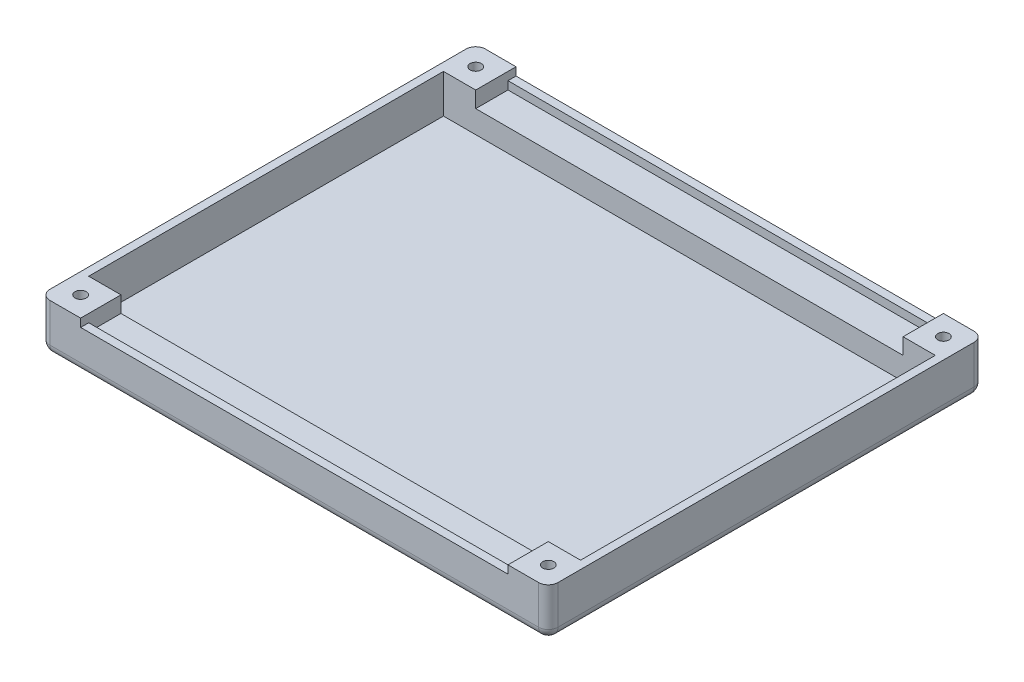
ISO-10303-21;
HEADER;
FILE_DESCRIPTION(('STEP AP214'),'2;1');
FILE_NAME('part.step','',(''),(''),'','','');
FILE_SCHEMA(('AUTOMOTIVE_DESIGN { 1 0 10303 214 1 1 1 1 }'));
ENDSEC;
DATA;
#1=APPLICATION_CONTEXT('core data for automotive mechanical design processes');
#2=APPLICATION_PROTOCOL_DEFINITION('international standard','automotive_design',2000,#1);
#3=PRODUCT_CONTEXT('',#1,'mechanical');
#4=PRODUCT('Part','Part','',(#3));
#5=PRODUCT_RELATED_PRODUCT_CATEGORY('part','',(#4));
#6=PRODUCT_DEFINITION_FORMATION('','',#4);
#7=PRODUCT_DEFINITION_CONTEXT('part definition',#1,'design');
#8=PRODUCT_DEFINITION('design','',#6,#7);
#9=PRODUCT_DEFINITION_SHAPE('','',#8);
#10=(LENGTH_UNIT() NAMED_UNIT(*) SI_UNIT(.MILLI.,.METRE.));
#11=(NAMED_UNIT(*) PLANE_ANGLE_UNIT() SI_UNIT($,.RADIAN.));
#12=(NAMED_UNIT(*) SI_UNIT($,.STERADIAN.) SOLID_ANGLE_UNIT());
#13=UNCERTAINTY_MEASURE_WITH_UNIT(LENGTH_MEASURE(1.E-05),#10,'distance_accuracy_value','');
#14=(GEOMETRIC_REPRESENTATION_CONTEXT(3) GLOBAL_UNCERTAINTY_ASSIGNED_CONTEXT((#13)) GLOBAL_UNIT_ASSIGNED_CONTEXT((#10,
#11,#12)) REPRESENTATION_CONTEXT('',''));
#15=CARTESIAN_POINT('',(0.,0.,0.));
#16=DIRECTION('',(0.,0.,1.));
#17=DIRECTION('',(1.,0.,0.));
#18=AXIS2_PLACEMENT_3D('',#15,#16,#17);
#19=CARTESIAN_POINT('',(0.,19.05,0.));
#20=DIRECTION('',(0.,-1.,0.));
#21=DIRECTION('',(0.,0.,-1.));
#22=AXIS2_PLACEMENT_3D('',#19,#20,#21);
#23=PLANE('',#22);
#24=CARTESIAN_POINT('',(92.075,19.05,-77.7875));
#25=DIRECTION('',(0.,1.,0.));
#26=DIRECTION('',(0.,0.,1.));
#27=AXIS2_PLACEMENT_3D('',#24,#25,#26);
#28=CIRCLE('',#27,2.2);
#29=CARTESIAN_POINT('',(92.075,19.05,-75.5875));
#30=VERTEX_POINT('',#29);
#31=EDGE_CURVE('E401',#30,#30,#28,.T.);
#32=ORIENTED_EDGE('',*,*,#31,.F.);
#33=EDGE_LOOP('',(#32));
#34=FACE_BOUND('',#33,.T.);
#35=CARTESIAN_POINT('',(92.075,19.05,77.7875));
#36=DIRECTION('',(0.,1.,0.));
#37=DIRECTION('',(0.,0.,-1.));
#38=AXIS2_PLACEMENT_3D('',#35,#36,#37);
#39=CIRCLE('',#38,2.2);
#40=CARTESIAN_POINT('',(92.075,19.05,75.5875));
#41=VERTEX_POINT('',#40);
#42=EDGE_CURVE('E507',#41,#41,#39,.T.);
#43=ORIENTED_EDGE('',*,*,#42,.F.);
#44=EDGE_LOOP('',(#43));
#45=FACE_BOUND('',#44,.T.);
#46=DIRECTION('',(1.,0.,0.));
#47=VECTOR('',#46,1.);
#48=CARTESIAN_POINT('',(-100.0125,19.05,85.725));
#49=LINE('',#48,#47);
#50=CARTESIAN_POINT('',(84.1375,19.05,85.725));
#51=VERTEX_POINT('',#50);
#52=CARTESIAN_POINT('',(96.2024999999999,19.05,85.725));
#53=VERTEX_POINT('',#52);
#54=EDGE_CURVE('E385',#51,#53,#49,.T.);
#55=ORIENTED_EDGE('',*,*,#54,.T.);
#56=CARTESIAN_POINT('',(96.2025,19.05,81.915));
#57=DIRECTION('',(0.,-1.,0.));
#58=DIRECTION('',(0.,0.,-1.));
#59=AXIS2_PLACEMENT_3D('',#56,#57,#58);
#60=CIRCLE('',#59,3.81);
#61=CARTESIAN_POINT('',(100.0125,19.05,81.915));
#62=VERTEX_POINT('',#61);
#63=EDGE_CURVE('E454',#53,#62,#60,.F.);
#64=ORIENTED_EDGE('',*,*,#63,.T.);
#65=DIRECTION('',(0.,0.,-1.));
#66=VECTOR('',#65,1.);
#67=CARTESIAN_POINT('',(100.0125,19.05,85.725));
#68=LINE('',#67,#66);
#69=CARTESIAN_POINT('',(100.0125,19.05,-81.915));
#70=VERTEX_POINT('',#69);
#71=EDGE_CURVE('E373',#62,#70,#68,.T.);
#72=ORIENTED_EDGE('',*,*,#71,.T.);
#73=CARTESIAN_POINT('',(96.2025,19.05,-81.915));
#74=DIRECTION('',(0.,-1.,0.));
#75=DIRECTION('',(0.,0.,-1.));
#76=AXIS2_PLACEMENT_3D('',#73,#74,#75);
#77=CIRCLE('',#76,3.81);
#78=CARTESIAN_POINT('',(96.2024999999999,19.05,-85.725));
#79=VERTEX_POINT('',#78);
#80=EDGE_CURVE('E451',#70,#79,#77,.F.);
#81=ORIENTED_EDGE('',*,*,#80,.T.);
#82=DIRECTION('',(-1.,0.,0.));
#83=VECTOR('',#82,1.);
#84=CARTESIAN_POINT('',(-100.0125,19.05,-85.725));
#85=LINE('',#84,#83);
#86=CARTESIAN_POINT('',(84.1375,19.05,-85.725));
#87=VERTEX_POINT('',#86);
#88=EDGE_CURVE('E378',#79,#87,#85,.T.);
#89=ORIENTED_EDGE('',*,*,#88,.T.);
#90=DIRECTION('',(0.,0.,-1.));
#91=VECTOR('',#90,1.);
#92=CARTESIAN_POINT('',(84.1375,19.05,85.725));
#93=LINE('',#92,#91);
#94=CARTESIAN_POINT('',(84.1375,19.05,-69.85));
#95=VERTEX_POINT('',#94);
#96=EDGE_CURVE('E284',#95,#87,#93,.T.);
#97=ORIENTED_EDGE('',*,*,#96,.F.);
#98=DIRECTION('',(-1.,0.,0.));
#99=VECTOR('',#98,1.);
#100=CARTESIAN_POINT('',(-96.8375,19.05,-69.85));
#101=LINE('',#100,#99);
#102=CARTESIAN_POINT('',(96.8374999999999,19.05,-69.85));
#103=VERTEX_POINT('',#102);
#104=EDGE_CURVE('E337',#103,#95,#101,.T.);
#105=ORIENTED_EDGE('',*,*,#104,.F.);
#106=DIRECTION('',(0.,0.,-1.));
#107=VECTOR('',#106,1.);
#108=CARTESIAN_POINT('',(96.8374999999999,19.05,69.85));
#109=LINE('',#108,#107);
#110=CARTESIAN_POINT('',(96.8374999999999,19.05,69.85));
#111=VERTEX_POINT('',#110);
#112=EDGE_CURVE('E326',#111,#103,#109,.T.);
#113=ORIENTED_EDGE('',*,*,#112,.F.);
#114=DIRECTION('',(1.,0.,0.));
#115=VECTOR('',#114,1.);
#116=CARTESIAN_POINT('',(-96.8375,19.05,69.85));
#117=LINE('',#116,#115);
#118=CARTESIAN_POINT('',(84.1375,19.05,69.85));
#119=VERTEX_POINT('',#118);
#120=EDGE_CURVE('E332',#119,#111,#117,.T.);
#121=ORIENTED_EDGE('',*,*,#120,.F.);
#122=EDGE_CURVE('E306',#51,#119,#93,.T.);
#123=ORIENTED_EDGE('',*,*,#122,.F.);
#124=EDGE_LOOP('',(#55,#64,#72,#81,#89,#97,#105,#113,#121,#123));
#125=FACE_BOUND('',#124,.T.);
#126=ADVANCED_FACE('F41',(#34,#45,#125),#23,.F.);
#127=CARTESIAN_POINT('',(100.0125,19.05,85.725));
#128=DIRECTION('',(-1.,0.,0.));
#129=DIRECTION('',(0.,0.,1.));
#130=AXIS2_PLACEMENT_3D('',#127,#128,#129);
#131=PLANE('',#130);
#132=ORIENTED_EDGE('',*,*,#71,.F.);
#133=DIRECTION('',(0.,-1.,0.));
#134=VECTOR('',#133,1.);
#135=CARTESIAN_POINT('',(100.0125,19.05,81.915));
#136=LINE('',#135,#134);
#137=CARTESIAN_POINT('',(100.0125,3.81,81.915));
#138=VERTEX_POINT('',#137);
#139=EDGE_CURVE('E448',#62,#138,#136,.T.);
#140=ORIENTED_EDGE('',*,*,#139,.T.);
#141=DIRECTION('',(0.,0.,-1.));
#142=VECTOR('',#141,1.);
#143=CARTESIAN_POINT('',(100.0125,3.81,-85.725));
#144=LINE('',#143,#142);
#145=CARTESIAN_POINT('',(100.0125,3.81,-81.915));
#146=VERTEX_POINT('',#145);
#147=EDGE_CURVE('E445',#138,#146,#144,.T.);
#148=ORIENTED_EDGE('',*,*,#147,.T.);
#149=DIRECTION('',(0.,-1.,0.));
#150=VECTOR('',#149,1.);
#151=CARTESIAN_POINT('',(100.0125,19.05,-81.915));
#152=LINE('',#151,#150);
#153=EDGE_CURVE('E442',#146,#70,#152,.F.);
#154=ORIENTED_EDGE('',*,*,#153,.T.);
#155=EDGE_LOOP('',(#132,#140,#148,#154));
#156=FACE_BOUND('',#155,.T.);
#157=ADVANCED_FACE('F536',(#156),#131,.F.);
#158=CARTESIAN_POINT('',(-100.0125,19.05,-85.725));
#159=DIRECTION('',(0.,0.,1.));
#160=DIRECTION('',(1.,0.,0.));
#161=AXIS2_PLACEMENT_3D('',#158,#159,#160);
#162=PLANE('',#161);
#163=ORIENTED_EDGE('',*,*,#88,.F.);
#164=DIRECTION('',(0.,-1.,0.));
#165=VECTOR('',#164,1.);
#166=CARTESIAN_POINT('',(96.2025,19.05,-85.725));
#167=LINE('',#166,#165);
#168=CARTESIAN_POINT('',(96.2025,3.81,-85.725));
#169=VERTEX_POINT('',#168);
#170=EDGE_CURVE('E12',#79,#169,#167,.T.);
#171=ORIENTED_EDGE('',*,*,#170,.T.);
#172=DIRECTION('',(-1.,0.,0.));
#173=VECTOR('',#172,1.);
#174=CARTESIAN_POINT('',(-100.0125,3.81,-85.725));
#175=LINE('',#174,#173);
#176=CARTESIAN_POINT('',(-96.2025,3.81,-85.725));
#177=VERTEX_POINT('',#176);
#178=EDGE_CURVE('E51',#169,#177,#175,.T.);
#179=ORIENTED_EDGE('',*,*,#178,.T.);
#180=DIRECTION('',(0.,-1.,0.));
#181=VECTOR('',#180,1.);
#182=CARTESIAN_POINT('',(-96.2025,19.05,-85.725));
#183=LINE('',#182,#181);
#184=CARTESIAN_POINT('',(-96.2025,19.05,-85.725));
#185=VERTEX_POINT('',#184);
#186=EDGE_CURVE('E457',#177,#185,#183,.F.);
#187=ORIENTED_EDGE('',*,*,#186,.T.);
#188=CARTESIAN_POINT('',(-84.1374999999999,19.05,-85.725));
#189=VERTEX_POINT('',#188);
#190=EDGE_CURVE('E377',#189,#185,#85,.T.);
#191=ORIENTED_EDGE('',*,*,#190,.F.);
#192=DIRECTION('',(0.,1.,0.));
#193=VECTOR('',#192,1.);
#194=CARTESIAN_POINT('',(-84.1374999999999,15.875,-85.725));
#195=LINE('',#194,#193);
#196=CARTESIAN_POINT('',(-84.1374999999999,15.875,-85.725));
#197=VERTEX_POINT('',#196);
#198=EDGE_CURVE('E318',#197,#189,#195,.T.);
#199=ORIENTED_EDGE('',*,*,#198,.F.);
#200=DIRECTION('',(-1.,0.,0.));
#201=VECTOR('',#200,1.);
#202=CARTESIAN_POINT('',(-84.1374999999999,15.875,-85.725));
#203=LINE('',#202,#201);
#204=CARTESIAN_POINT('',(84.1375,15.875,-85.725));
#205=VERTEX_POINT('',#204);
#206=EDGE_CURVE('E291',#205,#197,#203,.T.);
#207=ORIENTED_EDGE('',*,*,#206,.F.);
#208=DIRECTION('',(0.,1.,0.));
#209=VECTOR('',#208,1.);
#210=CARTESIAN_POINT('',(84.1375,15.875,-85.725));
#211=LINE('',#210,#209);
#212=EDGE_CURVE('E305',#205,#87,#211,.T.);
#213=ORIENTED_EDGE('',*,*,#212,.T.);
#214=EDGE_LOOP('',(#163,#171,#179,#187,#191,#199,#207,#213));
#215=FACE_BOUND('',#214,.T.);
#216=ADVANCED_FACE('F570',(#215),#162,.F.);
#217=CARTESIAN_POINT('',(-100.0125,19.05,85.725));
#218=DIRECTION('',(1.,0.,0.));
#219=DIRECTION('',(0.,0.,-1.));
#220=AXIS2_PLACEMENT_3D('',#217,#218,#219);
#221=PLANE('',#220);
#222=DIRECTION('',(0.,0.,1.));
#223=VECTOR('',#222,1.);
#224=CARTESIAN_POINT('',(-100.0125,3.81,85.725));
#225=LINE('',#224,#223);
#226=CARTESIAN_POINT('',(-100.0125,3.81,-81.915));
#227=VERTEX_POINT('',#226);
#228=CARTESIAN_POINT('',(-100.0125,3.81,81.915));
#229=VERTEX_POINT('',#228);
#230=EDGE_CURVE('E407',#227,#229,#225,.T.);
#231=ORIENTED_EDGE('',*,*,#230,.T.);
#232=DIRECTION('',(0.,-1.,0.));
#233=VECTOR('',#232,1.);
#234=CARTESIAN_POINT('',(-100.0125,19.05,81.915));
#235=LINE('',#234,#233);
#236=CARTESIAN_POINT('',(-100.0125,19.05,81.915));
#237=VERTEX_POINT('',#236);
#238=EDGE_CURVE('E411',#229,#237,#235,.F.);
#239=ORIENTED_EDGE('',*,*,#238,.T.);
#240=DIRECTION('',(0.,0.,1.));
#241=VECTOR('',#240,1.);
#242=CARTESIAN_POINT('',(-100.0125,19.05,85.725));
#243=LINE('',#242,#241);
#244=CARTESIAN_POINT('',(-100.0125,19.05,-81.915));
#245=VERTEX_POINT('',#244);
#246=EDGE_CURVE('E381',#245,#237,#243,.T.);
#247=ORIENTED_EDGE('',*,*,#246,.F.);
#248=DIRECTION('',(0.,-1.,0.));
#249=VECTOR('',#248,1.);
#250=CARTESIAN_POINT('',(-100.0125,19.05,-81.915));
#251=LINE('',#250,#249);
#252=EDGE_CURVE('E396',#245,#227,#251,.T.);
#253=ORIENTED_EDGE('',*,*,#252,.T.);
#254=EDGE_LOOP('',(#231,#239,#247,#253));
#255=FACE_BOUND('',#254,.T.);
#256=ADVANCED_FACE('F598',(#255),#221,.F.);
#257=CARTESIAN_POINT('',(-100.0125,19.05,85.725));
#258=DIRECTION('',(0.,0.,-1.));
#259=DIRECTION('',(-1.,0.,0.));
#260=AXIS2_PLACEMENT_3D('',#257,#258,#259);
#261=PLANE('',#260);
#262=CARTESIAN_POINT('',(-96.2025,19.05,85.725));
#263=VERTEX_POINT('',#262);
#264=CARTESIAN_POINT('',(-84.1374999999999,19.05,85.725));
#265=VERTEX_POINT('',#264);
#266=EDGE_CURVE('E386',#263,#265,#49,.T.);
#267=ORIENTED_EDGE('',*,*,#266,.F.);
#268=DIRECTION('',(0.,-1.,0.));
#269=VECTOR('',#268,1.);
#270=CARTESIAN_POINT('',(-96.2025,19.05,85.725));
#271=LINE('',#270,#269);
#272=CARTESIAN_POINT('',(-96.2025,3.81,85.725));
#273=VERTEX_POINT('',#272);
#274=EDGE_CURVE('E433',#263,#273,#271,.T.);
#275=ORIENTED_EDGE('',*,*,#274,.T.);
#276=DIRECTION('',(1.,0.,0.));
#277=VECTOR('',#276,1.);
#278=CARTESIAN_POINT('',(100.0125,3.81,85.725));
#279=LINE('',#278,#277);
#280=CARTESIAN_POINT('',(96.2025,3.81,85.725));
#281=VERTEX_POINT('',#280);
#282=EDGE_CURVE('E430',#273,#281,#279,.T.);
#283=ORIENTED_EDGE('',*,*,#282,.T.);
#284=DIRECTION('',(0.,-1.,0.));
#285=VECTOR('',#284,1.);
#286=CARTESIAN_POINT('',(96.2025,19.05,85.725));
#287=LINE('',#286,#285);
#288=EDGE_CURVE('E427',#281,#53,#287,.F.);
#289=ORIENTED_EDGE('',*,*,#288,.T.);
#290=ORIENTED_EDGE('',*,*,#54,.F.);
#291=DIRECTION('',(0.,1.,0.));
#292=VECTOR('',#291,1.);
#293=CARTESIAN_POINT('',(84.1375,15.875,85.725));
#294=LINE('',#293,#292);
#295=CARTESIAN_POINT('',(84.1375,15.875,85.725));
#296=VERTEX_POINT('',#295);
#297=EDGE_CURVE('E226',#296,#51,#294,.T.);
#298=ORIENTED_EDGE('',*,*,#297,.F.);
#299=DIRECTION('',(1.,0.,0.));
#300=VECTOR('',#299,1.);
#301=CARTESIAN_POINT('',(-84.1374999999999,15.875,85.725));
#302=LINE('',#301,#300);
#303=CARTESIAN_POINT('',(-84.1374999999999,15.875,85.725));
#304=VERTEX_POINT('',#303);
#305=EDGE_CURVE('E301',#304,#296,#302,.T.);
#306=ORIENTED_EDGE('',*,*,#305,.F.);
#307=DIRECTION('',(0.,1.,0.));
#308=VECTOR('',#307,1.);
#309=CARTESIAN_POINT('',(-84.1374999999999,15.875,85.725));
#310=LINE('',#309,#308);
#311=EDGE_CURVE('E314',#304,#265,#310,.T.);
#312=ORIENTED_EDGE('',*,*,#311,.T.);
#313=EDGE_LOOP('',(#267,#275,#283,#289,#290,#298,#306,#312));
#314=FACE_BOUND('',#313,.T.);
#315=ADVANCED_FACE('F608',(#314),#261,.F.);
#316=CARTESIAN_POINT('',(-92.075,19.05,-77.7875));
#317=DIRECTION('',(0.,-1.,0.));
#318=DIRECTION('',(0.,0.,1.));
#319=AXIS2_PLACEMENT_3D('',#316,#317,#318);
#320=CIRCLE('',#319,2.2);
#321=CARTESIAN_POINT('',(-92.075,19.05,-75.5875));
#322=VERTEX_POINT('',#321);
#323=EDGE_CURVE('E511',#322,#322,#320,.T.);
#324=ORIENTED_EDGE('',*,*,#323,.T.);
#325=EDGE_LOOP('',(#324));
#326=FACE_BOUND('',#325,.T.);
#327=CARTESIAN_POINT('',(-92.075,19.05,77.7875));
#328=DIRECTION('',(0.,-1.,0.));
#329=DIRECTION('',(0.,0.,-1.));
#330=AXIS2_PLACEMENT_3D('',#327,#328,#329);
#331=CIRCLE('',#330,2.2);
#332=CARTESIAN_POINT('',(-92.075,19.05,75.5875));
#333=VERTEX_POINT('',#332);
#334=EDGE_CURVE('E518',#333,#333,#331,.T.);
#335=ORIENTED_EDGE('',*,*,#334,.T.);
#336=EDGE_LOOP('',(#335));
#337=FACE_BOUND('',#336,.T.);
#338=ORIENTED_EDGE('',*,*,#246,.T.);
#339=CARTESIAN_POINT('',(-96.2025,19.05,81.915));
#340=DIRECTION('',(0.,-1.,0.));
#341=DIRECTION('',(0.,0.,-1.));
#342=AXIS2_PLACEMENT_3D('',#339,#340,#341);
#343=CIRCLE('',#342,3.81);
#344=EDGE_CURVE('E439',#237,#263,#343,.F.);
#345=ORIENTED_EDGE('',*,*,#344,.T.);
#346=ORIENTED_EDGE('',*,*,#266,.T.);
#347=DIRECTION('',(0.,0.,1.));
#348=VECTOR('',#347,1.);
#349=CARTESIAN_POINT('',(-84.1374999999999,19.05,85.725));
#350=LINE('',#349,#348);
#351=CARTESIAN_POINT('',(-84.1374999999999,19.05,69.85));
#352=VERTEX_POINT('',#351);
#353=EDGE_CURVE('E309',#352,#265,#350,.T.);
#354=ORIENTED_EDGE('',*,*,#353,.F.);
#355=CARTESIAN_POINT('',(-96.8375,19.05,69.85));
#356=VERTEX_POINT('',#355);
#357=EDGE_CURVE('E327',#356,#352,#117,.T.);
#358=ORIENTED_EDGE('',*,*,#357,.F.);
#359=DIRECTION('',(0.,0.,1.));
#360=VECTOR('',#359,1.);
#361=CARTESIAN_POINT('',(-96.8375,19.05,69.85));
#362=LINE('',#361,#360);
#363=CARTESIAN_POINT('',(-96.8375,19.05,-69.85));
#364=VERTEX_POINT('',#363);
#365=EDGE_CURVE('E333',#364,#356,#362,.T.);
#366=ORIENTED_EDGE('',*,*,#365,.F.);
#367=CARTESIAN_POINT('',(-84.1374999999999,19.05,-69.85));
#368=VERTEX_POINT('',#367);
#369=EDGE_CURVE('E340',#368,#364,#101,.T.);
#370=ORIENTED_EDGE('',*,*,#369,.F.);
#371=EDGE_CURVE('E220',#189,#368,#350,.T.);
#372=ORIENTED_EDGE('',*,*,#371,.F.);
#373=ORIENTED_EDGE('',*,*,#190,.T.);
#374=CARTESIAN_POINT('',(-96.2025,19.05,-81.915));
#375=DIRECTION('',(0.,-1.,0.));
#376=DIRECTION('',(0.,0.,-1.));
#377=AXIS2_PLACEMENT_3D('',#374,#375,#376);
#378=CIRCLE('',#377,3.81);
#379=EDGE_CURVE('E436',#185,#245,#378,.F.);
#380=ORIENTED_EDGE('',*,*,#379,.T.);
#381=EDGE_LOOP('',(#338,#345,#346,#354,#358,#366,#370,#372,#373,#380));
#382=FACE_BOUND('',#381,.T.);
#383=ADVANCED_FACE('F539',(#326,#337,#382),#23,.F.);
#384=CARTESIAN_POINT('',(0.,0.,0.));
#385=DIRECTION('',(0.,-1.,0.));
#386=DIRECTION('',(0.,0.,-1.));
#387=AXIS2_PLACEMENT_3D('',#384,#385,#386);
#388=PLANE('',#387);
#389=CARTESIAN_POINT('',(-92.075,0.,-77.7875));
#390=DIRECTION('',(0.,-1.,0.));
#391=DIRECTION('',(0.,0.,-1.));
#392=AXIS2_PLACEMENT_3D('',#389,#390,#391);
#393=CIRCLE('',#392,2.2);
#394=CARTESIAN_POINT('',(-92.075,0.,-79.9875));
#395=VERTEX_POINT('',#394);
#396=EDGE_CURVE('E45',#395,#395,#393,.F.);
#397=ORIENTED_EDGE('',*,*,#396,.T.);
#398=EDGE_LOOP('',(#397));
#399=FACE_BOUND('',#398,.T.);
#400=CARTESIAN_POINT('',(-92.075,0.,77.7875));
#401=DIRECTION('',(0.,-1.,0.));
#402=DIRECTION('',(0.,0.,-1.));
#403=AXIS2_PLACEMENT_3D('',#400,#401,#402);
#404=CIRCLE('',#403,2.2);
#405=CARTESIAN_POINT('',(-92.075,0.,75.5875));
#406=VERTEX_POINT('',#405);
#407=EDGE_CURVE('E508',#406,#406,#404,.F.);
#408=ORIENTED_EDGE('',*,*,#407,.T.);
#409=EDGE_LOOP('',(#408));
#410=FACE_BOUND('',#409,.T.);
#411=DIRECTION('',(1.,0.,0.));
#412=VECTOR('',#411,1.);
#413=CARTESIAN_POINT('',(-100.0125,0.,81.915));
#414=LINE('',#413,#412);
#415=CARTESIAN_POINT('',(96.2025,0.,81.915));
#416=VERTEX_POINT('',#415);
#417=CARTESIAN_POINT('',(-96.2025,0.,81.915));
#418=VERTEX_POINT('',#417);
#419=EDGE_CURVE('E420',#416,#418,#414,.F.);
#420=ORIENTED_EDGE('',*,*,#419,.T.);
#421=DIRECTION('',(0.,0.,1.));
#422=VECTOR('',#421,1.);
#423=CARTESIAN_POINT('',(-96.2025,0.,-85.725));
#424=LINE('',#423,#422);
#425=CARTESIAN_POINT('',(-96.2025,0.,-81.915));
#426=VERTEX_POINT('',#425);
#427=EDGE_CURVE('E423',#418,#426,#424,.F.);
#428=ORIENTED_EDGE('',*,*,#427,.T.);
#429=DIRECTION('',(-1.,0.,0.));
#430=VECTOR('',#429,1.);
#431=CARTESIAN_POINT('',(100.0125,0.,-81.915));
#432=LINE('',#431,#430);
#433=CARTESIAN_POINT('',(96.2025,0.,-81.915));
#434=VERTEX_POINT('',#433);
#435=EDGE_CURVE('E414',#426,#434,#432,.F.);
#436=ORIENTED_EDGE('',*,*,#435,.T.);
#437=DIRECTION('',(0.,0.,-1.));
#438=VECTOR('',#437,1.);
#439=CARTESIAN_POINT('',(96.2025,0.,85.725));
#440=LINE('',#439,#438);
#441=EDGE_CURVE('E417',#434,#416,#440,.F.);
#442=ORIENTED_EDGE('',*,*,#441,.T.);
#443=EDGE_LOOP('',(#420,#428,#436,#442));
#444=FACE_BOUND('',#443,.T.);
#445=CARTESIAN_POINT('',(92.075,0.,-77.7875));
#446=DIRECTION('',(0.,-1.,0.));
#447=DIRECTION('',(0.,0.,-1.));
#448=AXIS2_PLACEMENT_3D('',#445,#446,#447);
#449=CIRCLE('',#448,2.2);
#450=CARTESIAN_POINT('',(92.075,0.,-79.9875));
#451=VERTEX_POINT('',#450);
#452=EDGE_CURVE('E254',#451,#451,#449,.T.);
#453=ORIENTED_EDGE('',*,*,#452,.F.);
#454=EDGE_LOOP('',(#453));
#455=FACE_BOUND('',#454,.T.);
#456=CARTESIAN_POINT('',(92.075,0.,77.7875));
#457=DIRECTION('',(0.,-1.,0.));
#458=DIRECTION('',(0.,0.,-1.));
#459=AXIS2_PLACEMENT_3D('',#456,#457,#458);
#460=CIRCLE('',#459,2.2);
#461=CARTESIAN_POINT('',(92.075,0.,75.5875));
#462=VERTEX_POINT('',#461);
#463=EDGE_CURVE('E397',#462,#462,#460,.T.);
#464=ORIENTED_EDGE('',*,*,#463,.F.);
#465=EDGE_LOOP('',(#464));
#466=FACE_BOUND('',#465,.T.);
#467=ADVANCED_FACE('F690',(#399,#410,#444,#455,#466),#388,.T.);
#468=CARTESIAN_POINT('',(0.,3.81,0.));
#469=DIRECTION('',(0.,-1.,0.));
#470=DIRECTION('',(0.,0.,-1.));
#471=AXIS2_PLACEMENT_3D('',#468,#469,#470);
#472=PLANE('',#471);
#473=DIRECTION('',(0.,0.,-1.));
#474=VECTOR('',#473,1.);
#475=CARTESIAN_POINT('',(96.8374999999999,3.81000000000001,69.85));
#476=LINE('',#475,#474);
#477=CARTESIAN_POINT('',(96.8375,3.81000000000001,69.85));
#478=VERTEX_POINT('',#477);
#479=CARTESIAN_POINT('',(96.8375,3.81000000000001,-69.85));
#480=VERTEX_POINT('',#479);
#481=EDGE_CURVE('E348',#478,#480,#476,.T.);
#482=ORIENTED_EDGE('',*,*,#481,.T.);
#483=DIRECTION('',(-1.,0.,0.));
#484=VECTOR('',#483,1.);
#485=CARTESIAN_POINT('',(-96.8375,3.81000000000001,-69.85));
#486=LINE('',#485,#484);
#487=CARTESIAN_POINT('',(-96.8375,3.81000000000001,-69.85));
#488=VERTEX_POINT('',#487);
#489=EDGE_CURVE('E331',#480,#488,#486,.T.);
#490=ORIENTED_EDGE('',*,*,#489,.T.);
#491=DIRECTION('',(0.,0.,1.));
#492=VECTOR('',#491,1.);
#493=CARTESIAN_POINT('',(-96.8375,3.81000000000001,69.85));
#494=LINE('',#493,#492);
#495=CARTESIAN_POINT('',(-96.8375,3.81000000000001,69.85));
#496=VERTEX_POINT('',#495);
#497=EDGE_CURVE('E359',#488,#496,#494,.T.);
#498=ORIENTED_EDGE('',*,*,#497,.T.);
#499=DIRECTION('',(1.,0.,0.));
#500=VECTOR('',#499,1.);
#501=CARTESIAN_POINT('',(-96.8375,3.81000000000001,69.85));
#502=LINE('',#501,#500);
#503=EDGE_CURVE('E354',#496,#478,#502,.T.);
#504=ORIENTED_EDGE('',*,*,#503,.T.);
#505=EDGE_LOOP('',(#482,#490,#498,#504));
#506=FACE_BOUND('',#505,.T.);
#507=ADVANCED_FACE('F688',(#506),#472,.F.);
#508=CARTESIAN_POINT('',(-96.8375,-238.801372745217,-69.85));
#509=DIRECTION('',(0.,0.,-1.));
#510=DIRECTION('',(-1.,0.,0.));
#511=AXIS2_PLACEMENT_3D('',#508,#509,#510);
#512=PLANE('',#511);
#513=DIRECTION('',(1.,0.,0.));
#514=VECTOR('',#513,1.);
#515=CARTESIAN_POINT('',(-84.1374999999999,12.7,-69.85));
#516=LINE('',#515,#514);
#517=CARTESIAN_POINT('',(-84.1374999999999,12.7,-69.85));
#518=VERTEX_POINT('',#517);
#519=CARTESIAN_POINT('',(84.1375,12.7,-69.85));
#520=VERTEX_POINT('',#519);
#521=EDGE_CURVE('E232',#518,#520,#516,.T.);
#522=ORIENTED_EDGE('',*,*,#521,.F.);
#523=DIRECTION('',(0.,1.,0.));
#524=VECTOR('',#523,1.);
#525=CARTESIAN_POINT('',(-84.1374999999999,-238.801372745217,-69.85));
#526=LINE('',#525,#524);
#527=EDGE_CURVE('E214',#518,#368,#526,.T.);
#528=ORIENTED_EDGE('',*,*,#527,.T.);
#529=ORIENTED_EDGE('',*,*,#369,.T.);
#530=DIRECTION('',(0.,1.,0.));
#531=VECTOR('',#530,1.);
#532=CARTESIAN_POINT('',(-96.8375,-238.801372745217,-69.85));
#533=LINE('',#532,#531);
#534=EDGE_CURVE('E347',#488,#364,#533,.T.);
#535=ORIENTED_EDGE('',*,*,#534,.F.);
#536=ORIENTED_EDGE('',*,*,#489,.F.);
#537=DIRECTION('',(0.,1.,0.));
#538=VECTOR('',#537,1.);
#539=CARTESIAN_POINT('',(96.8374999999999,-238.801372745217,-69.85));
#540=LINE('',#539,#538);
#541=EDGE_CURVE('E352',#480,#103,#540,.T.);
#542=ORIENTED_EDGE('',*,*,#541,.T.);
#543=ORIENTED_EDGE('',*,*,#104,.T.);
#544=DIRECTION('',(0.,-1.,0.));
#545=VECTOR('',#544,1.);
#546=CARTESIAN_POINT('',(84.1374999999999,-238.801372745217,-69.85));
#547=LINE('',#546,#545);
#548=EDGE_CURVE('E225',#95,#520,#547,.T.);
#549=ORIENTED_EDGE('',*,*,#548,.T.);
#550=EDGE_LOOP('',(#522,#528,#529,#535,#536,#542,#543,#549));
#551=FACE_BOUND('',#550,.T.);
#552=ADVANCED_FACE('F238',(#551),#512,.F.);
#553=CARTESIAN_POINT('',(-96.8375,-238.801372745217,69.85));
#554=DIRECTION('',(-1.,0.,0.));
#555=DIRECTION('',(0.,0.,1.));
#556=AXIS2_PLACEMENT_3D('',#553,#554,#555);
#557=PLANE('',#556);
#558=ORIENTED_EDGE('',*,*,#534,.T.);
#559=ORIENTED_EDGE('',*,*,#365,.T.);
#560=DIRECTION('',(0.,1.,0.));
#561=VECTOR('',#560,1.);
#562=CARTESIAN_POINT('',(-96.8375,-238.801372745217,69.85));
#563=LINE('',#562,#561);
#564=EDGE_CURVE('E358',#496,#356,#563,.T.);
#565=ORIENTED_EDGE('',*,*,#564,.F.);
#566=ORIENTED_EDGE('',*,*,#497,.F.);
#567=EDGE_LOOP('',(#558,#559,#565,#566));
#568=FACE_BOUND('',#567,.T.);
#569=ADVANCED_FACE('F681',(#568),#557,.F.);
#570=CARTESIAN_POINT('',(-96.8375,-238.801372745217,69.85));
#571=DIRECTION('',(0.,0.,1.));
#572=DIRECTION('',(1.,0.,0.));
#573=AXIS2_PLACEMENT_3D('',#570,#571,#572);
#574=PLANE('',#573);
#575=DIRECTION('',(0.,-1.,0.));
#576=VECTOR('',#575,1.);
#577=CARTESIAN_POINT('',(-84.1374999999999,-238.801372745217,69.85));
#578=LINE('',#577,#576);
#579=CARTESIAN_POINT('',(-84.1374999999999,12.7,69.85));
#580=VERTEX_POINT('',#579);
#581=EDGE_CURVE('E389',#352,#580,#578,.T.);
#582=ORIENTED_EDGE('',*,*,#581,.T.);
#583=DIRECTION('',(-1.,0.,0.));
#584=VECTOR('',#583,1.);
#585=CARTESIAN_POINT('',(-84.1374999999999,12.7,69.85));
#586=LINE('',#585,#584);
#587=CARTESIAN_POINT('',(84.1375,12.7,69.85));
#588=VERTEX_POINT('',#587);
#589=EDGE_CURVE('E273',#588,#580,#586,.T.);
#590=ORIENTED_EDGE('',*,*,#589,.F.);
#591=DIRECTION('',(0.,1.,0.));
#592=VECTOR('',#591,1.);
#593=CARTESIAN_POINT('',(84.1374999999999,-238.801372745217,69.85));
#594=LINE('',#593,#592);
#595=EDGE_CURVE('E392',#588,#119,#594,.T.);
#596=ORIENTED_EDGE('',*,*,#595,.T.);
#597=ORIENTED_EDGE('',*,*,#120,.T.);
#598=DIRECTION('',(0.,1.,0.));
#599=VECTOR('',#598,1.);
#600=CARTESIAN_POINT('',(96.8374999999999,-238.801372745217,69.85));
#601=LINE('',#600,#599);
#602=EDGE_CURVE('E353',#478,#111,#601,.T.);
#603=ORIENTED_EDGE('',*,*,#602,.F.);
#604=ORIENTED_EDGE('',*,*,#503,.F.);
#605=ORIENTED_EDGE('',*,*,#564,.T.);
#606=ORIENTED_EDGE('',*,*,#357,.T.);
#607=EDGE_LOOP('',(#582,#590,#596,#597,#603,#604,#605,#606));
#608=FACE_BOUND('',#607,.T.);
#609=ADVANCED_FACE('F677',(#608),#574,.F.);
#610=CARTESIAN_POINT('',(96.8374999999999,-238.801372745217,69.85));
#611=DIRECTION('',(1.,0.,0.));
#612=DIRECTION('',(0.,0.,-1.));
#613=AXIS2_PLACEMENT_3D('',#610,#611,#612);
#614=PLANE('',#613);
#615=ORIENTED_EDGE('',*,*,#602,.T.);
#616=ORIENTED_EDGE('',*,*,#112,.T.);
#617=ORIENTED_EDGE('',*,*,#541,.F.);
#618=ORIENTED_EDGE('',*,*,#481,.F.);
#619=EDGE_LOOP('',(#615,#616,#617,#618));
#620=FACE_BOUND('',#619,.T.);
#621=ADVANCED_FACE('F674',(#620),#614,.F.);
#622=CARTESIAN_POINT('',(0.,15.875,0.));
#623=DIRECTION('',(0.,-1.,0.));
#624=DIRECTION('',(0.,0.,-1.));
#625=AXIS2_PLACEMENT_3D('',#622,#623,#624);
#626=PLANE('',#625);
#627=DIRECTION('',(0.,0.,-1.));
#628=VECTOR('',#627,1.);
#629=CARTESIAN_POINT('',(84.1375,15.875,85.725));
#630=LINE('',#629,#628);
#631=CARTESIAN_POINT('',(84.1375,15.875,82.55));
#632=VERTEX_POINT('',#631);
#633=EDGE_CURVE('E287',#296,#632,#630,.T.);
#634=ORIENTED_EDGE('',*,*,#633,.T.);
#635=DIRECTION('',(1.,0.,0.));
#636=VECTOR('',#635,1.);
#637=CARTESIAN_POINT('',(-84.1374999999999,15.875,82.55));
#638=LINE('',#637,#636);
#639=CARTESIAN_POINT('',(-84.1374999999999,15.875,82.55));
#640=VERTEX_POINT('',#639);
#641=EDGE_CURVE('E258',#640,#632,#638,.T.);
#642=ORIENTED_EDGE('',*,*,#641,.F.);
#643=DIRECTION('',(0.,0.,1.));
#644=VECTOR('',#643,1.);
#645=CARTESIAN_POINT('',(-84.1374999999999,15.875,85.725));
#646=LINE('',#645,#644);
#647=EDGE_CURVE('E296',#640,#304,#646,.T.);
#648=ORIENTED_EDGE('',*,*,#647,.T.);
#649=ORIENTED_EDGE('',*,*,#305,.T.);
#650=EDGE_LOOP('',(#634,#642,#648,#649));
#651=FACE_BOUND('',#650,.T.);
#652=ADVANCED_FACE('F667',(#651),#626,.F.);
#653=CARTESIAN_POINT('',(-84.1374999999999,15.875,85.725));
#654=DIRECTION('',(-1.,0.,0.));
#655=DIRECTION('',(0.,0.,1.));
#656=AXIS2_PLACEMENT_3D('',#653,#654,#655);
#657=PLANE('',#656);
#658=ORIENTED_EDGE('',*,*,#353,.T.);
#659=ORIENTED_EDGE('',*,*,#311,.F.);
#660=ORIENTED_EDGE('',*,*,#647,.F.);
#661=DIRECTION('',(0.,1.,0.));
#662=VECTOR('',#661,1.);
#663=CARTESIAN_POINT('',(-84.1374999999999,12.7,82.55));
#664=LINE('',#663,#662);
#665=CARTESIAN_POINT('',(-84.1374999999999,12.7,82.55));
#666=VERTEX_POINT('',#665);
#667=EDGE_CURVE('E277',#666,#640,#664,.T.);
#668=ORIENTED_EDGE('',*,*,#667,.F.);
#669=DIRECTION('',(0.,0.,1.));
#670=VECTOR('',#669,1.);
#671=CARTESIAN_POINT('',(-84.1374999999999,12.7,69.85));
#672=LINE('',#671,#670);
#673=EDGE_CURVE('E261',#580,#666,#672,.T.);
#674=ORIENTED_EDGE('',*,*,#673,.F.);
#675=ORIENTED_EDGE('',*,*,#581,.F.);
#676=EDGE_LOOP('',(#658,#659,#660,#668,#674,#675));
#677=FACE_BOUND('',#676,.T.);
#678=ADVANCED_FACE('F670',(#677),#657,.F.);
#679=CARTESIAN_POINT('',(84.1375,15.875,85.725));
#680=DIRECTION('',(1.,0.,0.));
#681=DIRECTION('',(0.,0.,-1.));
#682=AXIS2_PLACEMENT_3D('',#679,#680,#681);
#683=PLANE('',#682);
#684=ORIENTED_EDGE('',*,*,#633,.F.);
#685=ORIENTED_EDGE('',*,*,#297,.T.);
#686=ORIENTED_EDGE('',*,*,#122,.T.);
#687=ORIENTED_EDGE('',*,*,#595,.F.);
#688=DIRECTION('',(0.,0.,-1.));
#689=VECTOR('',#688,1.);
#690=CARTESIAN_POINT('',(84.1375,12.7,69.85));
#691=LINE('',#690,#689);
#692=CARTESIAN_POINT('',(84.1375,12.7,82.55));
#693=VERTEX_POINT('',#692);
#694=EDGE_CURVE('E269',#693,#588,#691,.T.);
#695=ORIENTED_EDGE('',*,*,#694,.F.);
#696=DIRECTION('',(0.,1.,0.));
#697=VECTOR('',#696,1.);
#698=CARTESIAN_POINT('',(84.1375,12.7,82.55));
#699=LINE('',#698,#697);
#700=EDGE_CURVE('E280',#693,#632,#699,.T.);
#701=ORIENTED_EDGE('',*,*,#700,.T.);
#702=EDGE_LOOP('',(#684,#685,#686,#687,#695,#701));
#703=FACE_BOUND('',#702,.T.);
#704=ADVANCED_FACE('F673',(#703),#683,.F.);
#705=ORIENTED_EDGE('',*,*,#96,.T.);
#706=ORIENTED_EDGE('',*,*,#212,.F.);
#707=CARTESIAN_POINT('',(84.1375,15.875,-82.55));
#708=VERTEX_POINT('',#707);
#709=EDGE_CURVE('E292',#708,#205,#630,.T.);
#710=ORIENTED_EDGE('',*,*,#709,.F.);
#711=DIRECTION('',(0.,1.,0.));
#712=VECTOR('',#711,1.);
#713=CARTESIAN_POINT('',(84.1375,12.7,-82.55));
#714=LINE('',#713,#712);
#715=CARTESIAN_POINT('',(84.1375,12.7,-82.55));
#716=VERTEX_POINT('',#715);
#717=EDGE_CURVE('E250',#716,#708,#714,.T.);
#718=ORIENTED_EDGE('',*,*,#717,.F.);
#719=DIRECTION('',(0.,0.,-1.));
#720=VECTOR('',#719,1.);
#721=CARTESIAN_POINT('',(84.1375,12.7,-82.55));
#722=LINE('',#721,#720);
#723=EDGE_CURVE('E242',#520,#716,#722,.T.);
#724=ORIENTED_EDGE('',*,*,#723,.F.);
#725=ORIENTED_EDGE('',*,*,#548,.F.);
#726=EDGE_LOOP('',(#705,#706,#710,#718,#724,#725));
#727=FACE_BOUND('',#726,.T.);
#728=ADVANCED_FACE('F576',(#727),#683,.F.);
#729=CARTESIAN_POINT('',(-84.1374999999999,15.875,-82.55));
#730=VERTEX_POINT('',#729);
#731=EDGE_CURVE('E297',#197,#730,#646,.T.);
#732=ORIENTED_EDGE('',*,*,#731,.F.);
#733=ORIENTED_EDGE('',*,*,#198,.T.);
#734=ORIENTED_EDGE('',*,*,#371,.T.);
#735=ORIENTED_EDGE('',*,*,#527,.F.);
#736=DIRECTION('',(0.,0.,1.));
#737=VECTOR('',#736,1.);
#738=CARTESIAN_POINT('',(-84.1374999999999,12.7,-82.55));
#739=LINE('',#738,#737);
#740=CARTESIAN_POINT('',(-84.1374999999999,12.7,-82.55));
#741=VERTEX_POINT('',#740);
#742=EDGE_CURVE('E217',#741,#518,#739,.T.);
#743=ORIENTED_EDGE('',*,*,#742,.F.);
#744=DIRECTION('',(0.,1.,0.));
#745=VECTOR('',#744,1.);
#746=CARTESIAN_POINT('',(-84.1374999999999,12.7,-82.55));
#747=LINE('',#746,#745);
#748=EDGE_CURVE('E255',#741,#730,#747,.T.);
#749=ORIENTED_EDGE('',*,*,#748,.T.);
#750=EDGE_LOOP('',(#732,#733,#734,#735,#743,#749));
#751=FACE_BOUND('',#750,.T.);
#752=ADVANCED_FACE('F216',(#751),#657,.F.);
#753=ORIENTED_EDGE('',*,*,#731,.T.);
#754=DIRECTION('',(-1.,0.,0.));
#755=VECTOR('',#754,1.);
#756=CARTESIAN_POINT('',(-84.1374999999999,15.875,-82.55));
#757=LINE('',#756,#755);
#758=EDGE_CURVE('E236',#708,#730,#757,.T.);
#759=ORIENTED_EDGE('',*,*,#758,.F.);
#760=ORIENTED_EDGE('',*,*,#709,.T.);
#761=ORIENTED_EDGE('',*,*,#206,.T.);
#762=EDGE_LOOP('',(#753,#759,#760,#761));
#763=FACE_BOUND('',#762,.T.);
#764=ADVANCED_FACE('F662',(#763),#626,.F.);
#765=CARTESIAN_POINT('',(-84.1374999999999,12.7,82.55));
#766=DIRECTION('',(0.,0.,1.));
#767=DIRECTION('',(1.,0.,0.));
#768=AXIS2_PLACEMENT_3D('',#765,#766,#767);
#769=PLANE('',#768);
#770=ORIENTED_EDGE('',*,*,#641,.T.);
#771=ORIENTED_EDGE('',*,*,#700,.F.);
#772=DIRECTION('',(1.,0.,0.));
#773=VECTOR('',#772,1.);
#774=CARTESIAN_POINT('',(-84.1374999999999,12.7,82.55));
#775=LINE('',#774,#773);
#776=EDGE_CURVE('E265',#666,#693,#775,.T.);
#777=ORIENTED_EDGE('',*,*,#776,.F.);
#778=ORIENTED_EDGE('',*,*,#667,.T.);
#779=EDGE_LOOP('',(#770,#771,#777,#778));
#780=FACE_BOUND('',#779,.T.);
#781=ADVANCED_FACE('F658',(#780),#769,.F.);
#782=CARTESIAN_POINT('',(0.,12.7,0.));
#783=DIRECTION('',(0.,1.,0.));
#784=DIRECTION('',(0.,0.,1.));
#785=AXIS2_PLACEMENT_3D('',#782,#783,#784);
#786=PLANE('',#785);
#787=ORIENTED_EDGE('',*,*,#673,.T.);
#788=ORIENTED_EDGE('',*,*,#776,.T.);
#789=ORIENTED_EDGE('',*,*,#694,.T.);
#790=ORIENTED_EDGE('',*,*,#589,.T.);
#791=EDGE_LOOP('',(#787,#788,#789,#790));
#792=FACE_BOUND('',#791,.T.);
#793=ADVANCED_FACE('F654',(#792),#786,.T.);
#794=CARTESIAN_POINT('',(-84.1374999999999,12.7,-82.55));
#795=DIRECTION('',(0.,0.,-1.));
#796=DIRECTION('',(-1.,0.,0.));
#797=AXIS2_PLACEMENT_3D('',#794,#795,#796);
#798=PLANE('',#797);
#799=ORIENTED_EDGE('',*,*,#758,.T.);
#800=ORIENTED_EDGE('',*,*,#748,.F.);
#801=DIRECTION('',(-1.,0.,0.));
#802=VECTOR('',#801,1.);
#803=CARTESIAN_POINT('',(-84.1374999999999,12.7,-82.55));
#804=LINE('',#803,#802);
#805=EDGE_CURVE('E234',#716,#741,#804,.T.);
#806=ORIENTED_EDGE('',*,*,#805,.F.);
#807=ORIENTED_EDGE('',*,*,#717,.T.);
#808=EDGE_LOOP('',(#799,#800,#806,#807));
#809=FACE_BOUND('',#808,.T.);
#810=ADVANCED_FACE('F651',(#809),#798,.F.);
#811=CARTESIAN_POINT('',(0.,12.7,0.));
#812=DIRECTION('',(0.,1.,0.));
#813=DIRECTION('',(0.,0.,1.));
#814=AXIS2_PLACEMENT_3D('',#811,#812,#813);
#815=PLANE('',#814);
#816=ORIENTED_EDGE('',*,*,#742,.T.);
#817=ORIENTED_EDGE('',*,*,#521,.T.);
#818=ORIENTED_EDGE('',*,*,#723,.T.);
#819=ORIENTED_EDGE('',*,*,#805,.T.);
#820=EDGE_LOOP('',(#816,#817,#818,#819));
#821=FACE_BOUND('',#820,.T.);
#822=ADVANCED_FACE('F230',(#821),#815,.T.);
#823=CARTESIAN_POINT('',(92.075,-14.45,77.7875));
#824=DIRECTION('',(0.,1.,0.));
#825=DIRECTION('',(0.,0.,1.));
#826=AXIS2_PLACEMENT_3D('',#823,#824,#825);
#827=CYLINDRICAL_SURFACE('',#826,2.2);
#828=ORIENTED_EDGE('',*,*,#463,.T.);
#829=EDGE_LOOP('',(#828));
#830=FACE_BOUND('',#829,.T.);
#831=ORIENTED_EDGE('',*,*,#42,.T.);
#832=EDGE_LOOP('',(#831));
#833=FACE_BOUND('',#832,.T.);
#834=ADVANCED_FACE('F532',(#830,#833),#827,.F.);
#835=CARTESIAN_POINT('',(92.075,-14.45,-77.7875));
#836=DIRECTION('',(0.,1.,0.));
#837=DIRECTION('',(0.,0.,1.));
#838=AXIS2_PLACEMENT_3D('',#835,#836,#837);
#839=CYLINDRICAL_SURFACE('',#838,2.2);
#840=ORIENTED_EDGE('',*,*,#452,.T.);
#841=EDGE_LOOP('',(#840));
#842=FACE_BOUND('',#841,.T.);
#843=ORIENTED_EDGE('',*,*,#31,.T.);
#844=EDGE_LOOP('',(#843));
#845=FACE_BOUND('',#844,.T.);
#846=ADVANCED_FACE('F633',(#842,#845),#839,.F.);
#847=CARTESIAN_POINT('',(96.2025,19.05,-81.915));
#848=DIRECTION('',(0.,-1.,0.));
#849=DIRECTION('',(0.,0.,-1.));
#850=AXIS2_PLACEMENT_3D('',#847,#848,#849);
#851=CYLINDRICAL_SURFACE('',#850,3.81);
#852=ORIENTED_EDGE('',*,*,#80,.F.);
#853=ORIENTED_EDGE('',*,*,#153,.F.);
#854=CARTESIAN_POINT('',(96.2025,3.81,-81.915));
#855=DIRECTION('',(0.,-1.,0.));
#856=DIRECTION('',(0.,0.,-1.));
#857=AXIS2_PLACEMENT_3D('',#854,#855,#856);
#858=CIRCLE('',#857,3.81);
#859=EDGE_CURVE('E500',#169,#146,#858,.T.);
#860=ORIENTED_EDGE('',*,*,#859,.F.);
#861=ORIENTED_EDGE('',*,*,#170,.F.);
#862=EDGE_LOOP('',(#852,#853,#860,#861));
#863=FACE_BOUND('',#862,.T.);
#864=ADVANCED_FACE('F43',(#863),#851,.T.);
#865=CARTESIAN_POINT('',(96.2025,19.05,81.915));
#866=DIRECTION('',(0.,-1.,0.));
#867=DIRECTION('',(0.,0.,-1.));
#868=AXIS2_PLACEMENT_3D('',#865,#866,#867);
#869=CYLINDRICAL_SURFACE('',#868,3.81);
#870=ORIENTED_EDGE('',*,*,#63,.F.);
#871=ORIENTED_EDGE('',*,*,#288,.F.);
#872=CARTESIAN_POINT('',(96.2025,3.81,81.915));
#873=DIRECTION('',(0.,-1.,0.));
#874=DIRECTION('',(0.,0.,-1.));
#875=AXIS2_PLACEMENT_3D('',#872,#873,#874);
#876=CIRCLE('',#875,3.81);
#877=EDGE_CURVE('E496',#138,#281,#876,.T.);
#878=ORIENTED_EDGE('',*,*,#877,.F.);
#879=ORIENTED_EDGE('',*,*,#139,.F.);
#880=EDGE_LOOP('',(#870,#871,#878,#879));
#881=FACE_BOUND('',#880,.T.);
#882=ADVANCED_FACE('F552',(#881),#869,.T.);
#883=CARTESIAN_POINT('',(96.2025,3.81,85.725));
#884=DIRECTION('',(0.,0.,1.));
#885=DIRECTION('',(1.,0.,0.));
#886=AXIS2_PLACEMENT_3D('',#883,#884,#885);
#887=CYLINDRICAL_SURFACE('',#886,3.81);
#888=CARTESIAN_POINT('',(96.2025,3.81,-81.915));
#889=DIRECTION('',(0.,0.,-1.));
#890=DIRECTION('',(-1.,0.,0.));
#891=AXIS2_PLACEMENT_3D('',#888,#889,#890);
#892=CIRCLE('',#891,3.81);
#893=EDGE_CURVE('E504',#146,#434,#892,.T.);
#894=ORIENTED_EDGE('',*,*,#893,.F.);
#895=ORIENTED_EDGE('',*,*,#147,.F.);
#896=CARTESIAN_POINT('',(96.2025,3.81,81.915));
#897=DIRECTION('',(0.,0.,1.));
#898=DIRECTION('',(1.,0.,0.));
#899=AXIS2_PLACEMENT_3D('',#896,#897,#898);
#900=CIRCLE('',#899,3.81);
#901=EDGE_CURVE('E492',#416,#138,#900,.T.);
#902=ORIENTED_EDGE('',*,*,#901,.F.);
#903=ORIENTED_EDGE('',*,*,#441,.F.);
#904=EDGE_LOOP('',(#894,#895,#902,#903));
#905=FACE_BOUND('',#904,.T.);
#906=ADVANCED_FACE('F560',(#905),#887,.T.);
#907=CARTESIAN_POINT('',(96.2025,3.81,-81.915));
#908=DIRECTION('',(0.,0.,1.));
#909=DIRECTION('',(1.,0.,0.));
#910=AXIS2_PLACEMENT_3D('',#907,#908,#909);
#911=SPHERICAL_SURFACE('',#910,3.81);
#912=ORIENTED_EDGE('',*,*,#859,.T.);
#913=ORIENTED_EDGE('',*,*,#893,.T.);
#914=CARTESIAN_POINT('',(96.2025,3.81,-81.915));
#915=DIRECTION('',(1.,0.,0.));
#916=DIRECTION('',(0.,0.,-1.));
#917=AXIS2_PLACEMENT_3D('',#914,#915,#916);
#918=CIRCLE('',#917,3.81);
#919=EDGE_CURVE('E488',#169,#434,#918,.F.);
#920=ORIENTED_EDGE('',*,*,#919,.F.);
#921=EDGE_LOOP('',(#912,#913,#920));
#922=FACE_BOUND('',#921,.T.);
#923=ADVANCED_FACE('F565',(#922),#911,.T.);
#924=CARTESIAN_POINT('',(96.2025,3.81,81.915));
#925=DIRECTION('',(0.,0.,1.));
#926=DIRECTION('',(1.,0.,0.));
#927=AXIS2_PLACEMENT_3D('',#924,#925,#926);
#928=SPHERICAL_SURFACE('',#927,3.81);
#929=ORIENTED_EDGE('',*,*,#901,.T.);
#930=ORIENTED_EDGE('',*,*,#877,.T.);
#931=CARTESIAN_POINT('',(96.2025,3.81,81.915));
#932=DIRECTION('',(1.,0.,0.));
#933=DIRECTION('',(0.,0.,-1.));
#934=AXIS2_PLACEMENT_3D('',#931,#932,#933);
#935=CIRCLE('',#934,3.81);
#936=EDGE_CURVE('E484',#416,#281,#935,.F.);
#937=ORIENTED_EDGE('',*,*,#936,.F.);
#938=EDGE_LOOP('',(#929,#930,#937));
#939=FACE_BOUND('',#938,.T.);
#940=ADVANCED_FACE('F615',(#939),#928,.T.);
#941=CARTESIAN_POINT('',(-100.0125,3.81,-81.915));
#942=DIRECTION('',(1.,0.,0.));
#943=DIRECTION('',(0.,0.,-1.));
#944=AXIS2_PLACEMENT_3D('',#941,#942,#943);
#945=CYLINDRICAL_SURFACE('',#944,3.81);
#946=ORIENTED_EDGE('',*,*,#919,.T.);
#947=ORIENTED_EDGE('',*,*,#435,.F.);
#948=CARTESIAN_POINT('',(-96.2025,3.81,-81.915));
#949=DIRECTION('',(-1.,0.,0.));
#950=DIRECTION('',(0.,0.,1.));
#951=AXIS2_PLACEMENT_3D('',#948,#949,#950);
#952=CIRCLE('',#951,3.81);
#953=EDGE_CURVE('E480',#177,#426,#952,.T.);
#954=ORIENTED_EDGE('',*,*,#953,.F.);
#955=ORIENTED_EDGE('',*,*,#178,.F.);
#956=EDGE_LOOP('',(#946,#947,#954,#955));
#957=FACE_BOUND('',#956,.T.);
#958=ADVANCED_FACE('F617',(#957),#945,.T.);
#959=CARTESIAN_POINT('',(-96.2025,19.05,-81.915));
#960=DIRECTION('',(0.,-1.,0.));
#961=DIRECTION('',(0.,0.,-1.));
#962=AXIS2_PLACEMENT_3D('',#959,#960,#961);
#963=CYLINDRICAL_SURFACE('',#962,3.81);
#964=ORIENTED_EDGE('',*,*,#379,.F.);
#965=ORIENTED_EDGE('',*,*,#186,.F.);
#966=CARTESIAN_POINT('',(-96.2025,3.81,-81.915));
#967=DIRECTION('',(0.,-1.,0.));
#968=DIRECTION('',(0.,0.,-1.));
#969=AXIS2_PLACEMENT_3D('',#966,#967,#968);
#970=CIRCLE('',#969,3.81);
#971=EDGE_CURVE('E476',#227,#177,#970,.T.);
#972=ORIENTED_EDGE('',*,*,#971,.F.);
#973=ORIENTED_EDGE('',*,*,#252,.F.);
#974=EDGE_LOOP('',(#964,#965,#972,#973));
#975=FACE_BOUND('',#974,.T.);
#976=ADVANCED_FACE('F593',(#975),#963,.T.);
#977=CARTESIAN_POINT('',(-96.2025,19.05,81.915));
#978=DIRECTION('',(0.,-1.,0.));
#979=DIRECTION('',(0.,0.,-1.));
#980=AXIS2_PLACEMENT_3D('',#977,#978,#979);
#981=CYLINDRICAL_SURFACE('',#980,3.81);
#982=ORIENTED_EDGE('',*,*,#344,.F.);
#983=ORIENTED_EDGE('',*,*,#238,.F.);
#984=CARTESIAN_POINT('',(-96.2025,3.81,81.915));
#985=DIRECTION('',(0.,-1.,0.));
#986=DIRECTION('',(0.,0.,-1.));
#987=AXIS2_PLACEMENT_3D('',#984,#985,#986);
#988=CIRCLE('',#987,3.81);
#989=EDGE_CURVE('E472',#273,#229,#988,.T.);
#990=ORIENTED_EDGE('',*,*,#989,.F.);
#991=ORIENTED_EDGE('',*,*,#274,.F.);
#992=EDGE_LOOP('',(#982,#983,#990,#991));
#993=FACE_BOUND('',#992,.T.);
#994=ADVANCED_FACE('F605',(#993),#981,.T.);
#995=CARTESIAN_POINT('',(-100.0125,3.81,81.915));
#996=DIRECTION('',(-1.,0.,0.));
#997=DIRECTION('',(0.,0.,1.));
#998=AXIS2_PLACEMENT_3D('',#995,#996,#997);
#999=CYLINDRICAL_SURFACE('',#998,3.81);
#1000=ORIENTED_EDGE('',*,*,#936,.T.);
#1001=ORIENTED_EDGE('',*,*,#282,.F.);
#1002=CARTESIAN_POINT('',(-96.2025,3.81,81.915));
#1003=DIRECTION('',(-1.,0.,0.));
#1004=DIRECTION('',(0.,0.,1.));
#1005=AXIS2_PLACEMENT_3D('',#1002,#1003,#1004);
#1006=CIRCLE('',#1005,3.81);
#1007=EDGE_CURVE('E468',#418,#273,#1006,.T.);
#1008=ORIENTED_EDGE('',*,*,#1007,.F.);
#1009=ORIENTED_EDGE('',*,*,#419,.F.);
#1010=EDGE_LOOP('',(#1000,#1001,#1008,#1009));
#1011=FACE_BOUND('',#1010,.T.);
#1012=ADVANCED_FACE('F611',(#1011),#999,.T.);
#1013=CARTESIAN_POINT('',(-96.2025,3.81,-81.915));
#1014=DIRECTION('',(0.,0.,1.));
#1015=DIRECTION('',(1.,0.,0.));
#1016=AXIS2_PLACEMENT_3D('',#1013,#1014,#1015);
#1017=SPHERICAL_SURFACE('',#1016,3.81);
#1018=ORIENTED_EDGE('',*,*,#971,.T.);
#1019=ORIENTED_EDGE('',*,*,#953,.T.);
#1020=CARTESIAN_POINT('',(-96.2025,3.81,-81.915));
#1021=DIRECTION('',(0.,0.,-1.));
#1022=DIRECTION('',(-1.,0.,0.));
#1023=AXIS2_PLACEMENT_3D('',#1020,#1021,#1022);
#1024=CIRCLE('',#1023,3.81);
#1025=EDGE_CURVE('E465',#227,#426,#1024,.F.);
#1026=ORIENTED_EDGE('',*,*,#1025,.F.);
#1027=EDGE_LOOP('',(#1018,#1019,#1026));
#1028=FACE_BOUND('',#1027,.T.);
#1029=ADVANCED_FACE('F712',(#1028),#1017,.T.);
#1030=CARTESIAN_POINT('',(-96.2025,3.81,81.915));
#1031=DIRECTION('',(0.,0.,1.));
#1032=DIRECTION('',(1.,0.,0.));
#1033=AXIS2_PLACEMENT_3D('',#1030,#1031,#1032);
#1034=SPHERICAL_SURFACE('',#1033,3.81);
#1035=ORIENTED_EDGE('',*,*,#1007,.T.);
#1036=ORIENTED_EDGE('',*,*,#989,.T.);
#1037=CARTESIAN_POINT('',(-96.2025,3.81,81.915));
#1038=DIRECTION('',(0.,0.,1.));
#1039=DIRECTION('',(1.,0.,0.));
#1040=AXIS2_PLACEMENT_3D('',#1037,#1038,#1039);
#1041=CIRCLE('',#1040,3.81);
#1042=EDGE_CURVE('E462',#418,#229,#1041,.F.);
#1043=ORIENTED_EDGE('',*,*,#1042,.F.);
#1044=EDGE_LOOP('',(#1035,#1036,#1043));
#1045=FACE_BOUND('',#1044,.T.);
#1046=ADVANCED_FACE('F708',(#1045),#1034,.T.);
#1047=CARTESIAN_POINT('',(-96.2025,3.81,85.725));
#1048=DIRECTION('',(0.,0.,-1.));
#1049=DIRECTION('',(-1.,0.,0.));
#1050=AXIS2_PLACEMENT_3D('',#1047,#1048,#1049);
#1051=CYLINDRICAL_SURFACE('',#1050,3.81);
#1052=ORIENTED_EDGE('',*,*,#1025,.T.);
#1053=ORIENTED_EDGE('',*,*,#427,.F.);
#1054=ORIENTED_EDGE('',*,*,#1042,.T.);
#1055=ORIENTED_EDGE('',*,*,#230,.F.);
#1056=EDGE_LOOP('',(#1052,#1053,#1054,#1055));
#1057=FACE_BOUND('',#1056,.T.);
#1058=ADVANCED_FACE('F705',(#1057),#1051,.T.);
#1059=CARTESIAN_POINT('',(-92.075,-14.45,77.7875));
#1060=DIRECTION('',(0.,1.,0.));
#1061=DIRECTION('',(0.,0.,1.));
#1062=AXIS2_PLACEMENT_3D('',#1059,#1060,#1061);
#1063=CYLINDRICAL_SURFACE('',#1062,2.2);
#1064=ORIENTED_EDGE('',*,*,#407,.F.);
#1065=EDGE_LOOP('',(#1064));
#1066=FACE_BOUND('',#1065,.T.);
#1067=ORIENTED_EDGE('',*,*,#334,.F.);
#1068=EDGE_LOOP('',(#1067));
#1069=FACE_BOUND('',#1068,.T.);
#1070=ADVANCED_FACE('F646',(#1066,#1069),#1063,.F.);
#1071=CARTESIAN_POINT('',(-92.075,-14.45,-77.7875));
#1072=DIRECTION('',(0.,1.,0.));
#1073=DIRECTION('',(0.,0.,1.));
#1074=AXIS2_PLACEMENT_3D('',#1071,#1072,#1073);
#1075=CYLINDRICAL_SURFACE('',#1074,2.2);
#1076=ORIENTED_EDGE('',*,*,#396,.F.);
#1077=EDGE_LOOP('',(#1076));
#1078=FACE_BOUND('',#1077,.T.);
#1079=ORIENTED_EDGE('',*,*,#323,.F.);
#1080=EDGE_LOOP('',(#1079));
#1081=FACE_BOUND('',#1080,.T.);
#1082=ADVANCED_FACE('F752',(#1078,#1081),#1075,.F.);
#1083=CLOSED_SHELL('',(#126,#157,#216,#256,#315,#383,#467,#507,#552,#569,#609,#621,#652,#678,
#704,#728,#752,#764,#781,#793,#810,#822,#834,#846,#864,#882,#906,#923,#940,#958,#976,#994,#1012,
#1029,#1046,#1058,#1070,#1082));
#1084=MANIFOLD_SOLID_BREP('B2',#1083);
#1085=ADVANCED_BREP_SHAPE_REPRESENTATION('',(#18,#1084),#14);
#1086=SHAPE_DEFINITION_REPRESENTATION(#9,#1085);
ENDSEC;
END-ISO-10303-21;
